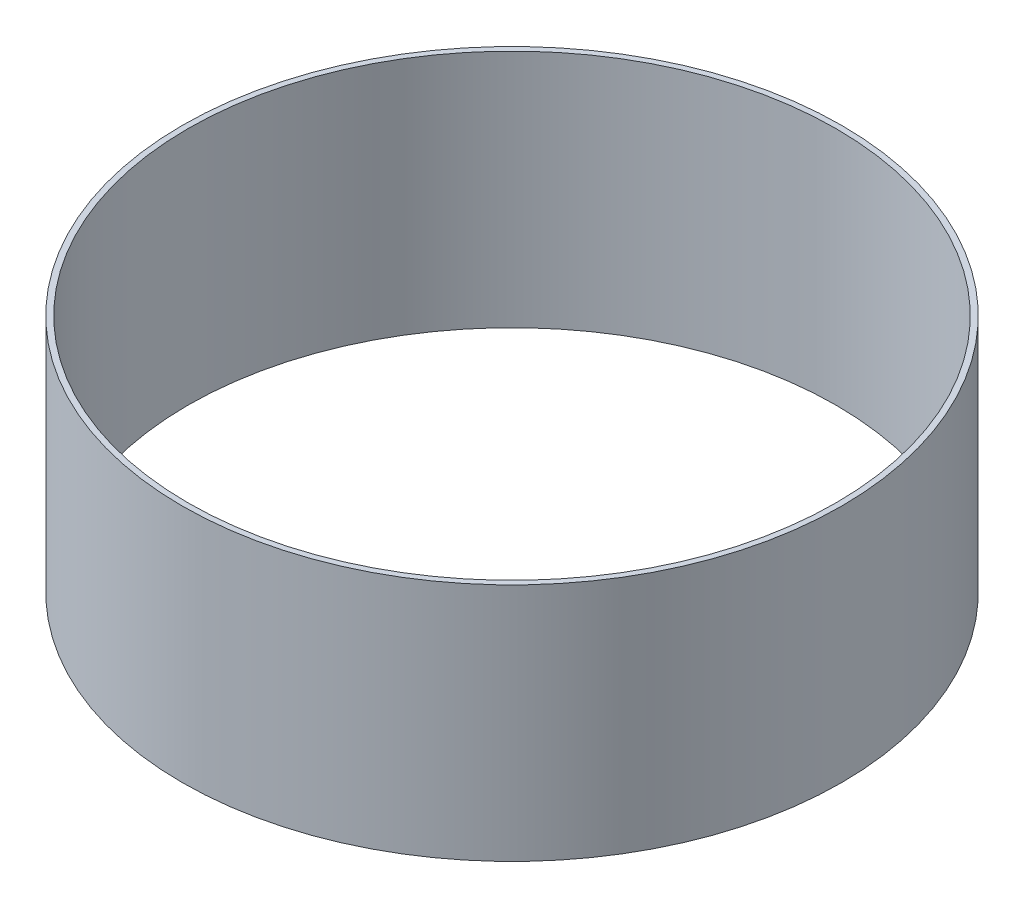
ISO-10303-21;
HEADER;
FILE_DESCRIPTION(('STEP AP214'),'2;1');
FILE_NAME('part.step','',(''),(''),'','','');
FILE_SCHEMA(('AUTOMOTIVE_DESIGN { 1 0 10303 214 1 1 1 1 }'));
ENDSEC;
DATA;
#1=APPLICATION_CONTEXT('core data for automotive mechanical design processes');
#2=APPLICATION_PROTOCOL_DEFINITION('international standard','automotive_design',2000,#1);
#3=PRODUCT_CONTEXT('',#1,'mechanical');
#4=PRODUCT('Part','Part','',(#3));
#5=PRODUCT_RELATED_PRODUCT_CATEGORY('part','',(#4));
#6=PRODUCT_DEFINITION_FORMATION('','',#4);
#7=PRODUCT_DEFINITION_CONTEXT('part definition',#1,'design');
#8=PRODUCT_DEFINITION('design','',#6,#7);
#9=PRODUCT_DEFINITION_SHAPE('','',#8);
#10=(LENGTH_UNIT() NAMED_UNIT(*) SI_UNIT(.MILLI.,.METRE.));
#11=(NAMED_UNIT(*) PLANE_ANGLE_UNIT() SI_UNIT($,.RADIAN.));
#12=(NAMED_UNIT(*) SI_UNIT($,.STERADIAN.) SOLID_ANGLE_UNIT());
#13=UNCERTAINTY_MEASURE_WITH_UNIT(LENGTH_MEASURE(1.E-05),#10,'distance_accuracy_value','');
#14=(GEOMETRIC_REPRESENTATION_CONTEXT(3) GLOBAL_UNCERTAINTY_ASSIGNED_CONTEXT((#13)) GLOBAL_UNIT_ASSIGNED_CONTEXT((#10,
#11,#12)) REPRESENTATION_CONTEXT('',''));
#15=CARTESIAN_POINT('',(0.,0.,0.));
#16=DIRECTION('',(0.,0.,1.));
#17=DIRECTION('',(1.,0.,0.));
#18=AXIS2_PLACEMENT_3D('',#15,#16,#17);
#19=CARTESIAN_POINT('',(0.,34.,0.));
#20=DIRECTION('',(0.,1.,0.));
#21=DIRECTION('',(0.,0.,1.));
#22=AXIS2_PLACEMENT_3D('',#19,#20,#21);
#23=PLANE('',#22);
#24=CARTESIAN_POINT('',(0.,34.,0.));
#25=DIRECTION('',(0.,1.,0.));
#26=DIRECTION('',(0.,0.,1.));
#27=AXIS2_PLACEMENT_3D('',#24,#25,#26);
#28=CIRCLE('',#27,46.8);
#29=CARTESIAN_POINT('',(0.,34.,46.8));
#30=VERTEX_POINT('',#29);
#31=EDGE_CURVE('E10',#30,#30,#28,.T.);
#32=ORIENTED_EDGE('',*,*,#31,.T.);
#33=EDGE_LOOP('',(#32));
#34=FACE_BOUND('',#33,.T.);
#35=CARTESIAN_POINT('',(0.,34.,0.));
#36=DIRECTION('',(0.,1.,0.));
#37=DIRECTION('',(0.,0.,1.));
#38=AXIS2_PLACEMENT_3D('',#35,#36,#37);
#39=CIRCLE('',#38,46.);
#40=CARTESIAN_POINT('',(0.,34.,46.));
#41=VERTEX_POINT('',#40);
#42=EDGE_CURVE('E56',#41,#41,#39,.T.);
#43=ORIENTED_EDGE('',*,*,#42,.F.);
#44=EDGE_LOOP('',(#43));
#45=FACE_BOUND('',#44,.T.);
#46=ADVANCED_FACE('F43',(#34,#45),#23,.T.);
#47=CARTESIAN_POINT('',(0.,0.,0.));
#48=DIRECTION('',(0.,1.,0.));
#49=DIRECTION('',(0.,0.,1.));
#50=AXIS2_PLACEMENT_3D('',#47,#48,#49);
#51=PLANE('',#50);
#52=CARTESIAN_POINT('',(0.,0.,0.));
#53=DIRECTION('',(0.,1.,0.));
#54=DIRECTION('',(0.,0.,1.));
#55=AXIS2_PLACEMENT_3D('',#52,#53,#54);
#56=CIRCLE('',#55,46.8);
#57=CARTESIAN_POINT('',(0.,0.,46.8));
#58=VERTEX_POINT('',#57);
#59=EDGE_CURVE('E47',#58,#58,#56,.T.);
#60=ORIENTED_EDGE('',*,*,#59,.F.);
#61=EDGE_LOOP('',(#60));
#62=FACE_BOUND('',#61,.T.);
#63=CARTESIAN_POINT('',(0.,0.,0.));
#64=DIRECTION('',(0.,1.,0.));
#65=DIRECTION('',(0.,0.,1.));
#66=AXIS2_PLACEMENT_3D('',#63,#64,#65);
#67=CIRCLE('',#66,46.);
#68=CARTESIAN_POINT('',(0.,0.,46.));
#69=VERTEX_POINT('',#68);
#70=EDGE_CURVE('E58',#69,#69,#67,.T.);
#71=ORIENTED_EDGE('',*,*,#70,.T.);
#72=EDGE_LOOP('',(#71));
#73=FACE_BOUND('',#72,.T.);
#74=ADVANCED_FACE('F70',(#62,#73),#51,.F.);
#75=CARTESIAN_POINT('',(0.,34.,0.));
#76=DIRECTION('',(0.,-1.,0.));
#77=DIRECTION('',(0.,0.,-1.));
#78=AXIS2_PLACEMENT_3D('',#75,#76,#77);
#79=CYLINDRICAL_SURFACE('',#78,46.8);
#80=ORIENTED_EDGE('',*,*,#31,.F.);
#81=EDGE_LOOP('',(#80));
#82=FACE_BOUND('',#81,.T.);
#83=ORIENTED_EDGE('',*,*,#59,.T.);
#84=EDGE_LOOP('',(#83));
#85=FACE_BOUND('',#84,.T.);
#86=ADVANCED_FACE('F45',(#82,#85),#79,.T.);
#87=CARTESIAN_POINT('',(0.,34.,0.));
#88=DIRECTION('',(0.,-1.,0.));
#89=DIRECTION('',(0.,0.,-1.));
#90=AXIS2_PLACEMENT_3D('',#87,#88,#89);
#91=CYLINDRICAL_SURFACE('',#90,46.);
#92=ORIENTED_EDGE('',*,*,#42,.T.);
#93=EDGE_LOOP('',(#92));
#94=FACE_BOUND('',#93,.T.);
#95=ORIENTED_EDGE('',*,*,#70,.F.);
#96=EDGE_LOOP('',(#95));
#97=FACE_BOUND('',#96,.T.);
#98=ADVANCED_FACE('F66',(#94,#97),#91,.F.);
#99=CLOSED_SHELL('',(#46,#74,#86,#98));
#100=MANIFOLD_SOLID_BREP('B2',#99);
#101=ADVANCED_BREP_SHAPE_REPRESENTATION('',(#18,#100),#14);
#102=SHAPE_DEFINITION_REPRESENTATION(#9,#101);
ENDSEC;
END-ISO-10303-21;
